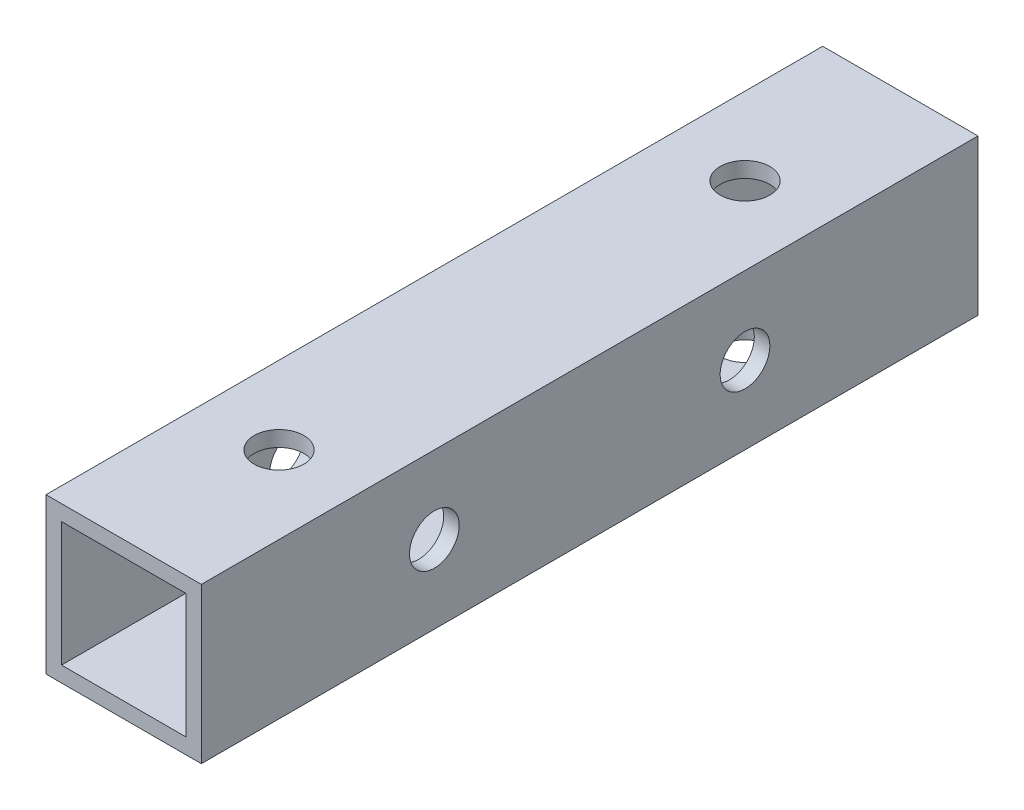
ISO-10303-21;
HEADER;
FILE_DESCRIPTION(('STEP AP214'),'2;1');
FILE_NAME('part.step','',(''),(''),'','','');
FILE_SCHEMA(('AUTOMOTIVE_DESIGN { 1 0 10303 214 1 1 1 1 }'));
ENDSEC;
DATA;
#1=APPLICATION_CONTEXT('core data for automotive mechanical design processes');
#2=APPLICATION_PROTOCOL_DEFINITION('international standard','automotive_design',2000,#1);
#3=PRODUCT_CONTEXT('',#1,'mechanical');
#4=PRODUCT('Part','Part','',(#3));
#5=PRODUCT_RELATED_PRODUCT_CATEGORY('part','',(#4));
#6=PRODUCT_DEFINITION_FORMATION('','',#4);
#7=PRODUCT_DEFINITION_CONTEXT('part definition',#1,'design');
#8=PRODUCT_DEFINITION('design','',#6,#7);
#9=PRODUCT_DEFINITION_SHAPE('','',#8);
#10=(LENGTH_UNIT() NAMED_UNIT(*) SI_UNIT(.MILLI.,.METRE.));
#11=(NAMED_UNIT(*) PLANE_ANGLE_UNIT() SI_UNIT($,.RADIAN.));
#12=(NAMED_UNIT(*) SI_UNIT($,.STERADIAN.) SOLID_ANGLE_UNIT());
#13=UNCERTAINTY_MEASURE_WITH_UNIT(LENGTH_MEASURE(1.E-05),#10,'distance_accuracy_value','');
#14=(GEOMETRIC_REPRESENTATION_CONTEXT(3) GLOBAL_UNCERTAINTY_ASSIGNED_CONTEXT((#13)) GLOBAL_UNIT_ASSIGNED_CONTEXT((#10,
#11,#12)) REPRESENTATION_CONTEXT('',''));
#15=CARTESIAN_POINT('',(0.,0.,0.));
#16=DIRECTION('',(0.,0.,1.));
#17=DIRECTION('',(1.,0.,0.));
#18=AXIS2_PLACEMENT_3D('',#15,#16,#17);
#19=CARTESIAN_POINT('',(0.,0.,50.));
#20=DIRECTION('',(0.,0.,1.));
#21=DIRECTION('',(1.,0.,0.));
#22=AXIS2_PLACEMENT_3D('',#19,#20,#21);
#23=PLANE('',#22);
#24=DIRECTION('',(0.,1.,0.));
#25=VECTOR('',#24,1.);
#26=CARTESIAN_POINT('',(5.,-5.,50.));
#27=LINE('',#26,#25);
#28=CARTESIAN_POINT('',(5.,-5.,50.));
#29=VERTEX_POINT('',#28);
#30=CARTESIAN_POINT('',(5.,5.,50.));
#31=VERTEX_POINT('',#30);
#32=EDGE_CURVE('E162',#29,#31,#27,.T.);
#33=ORIENTED_EDGE('',*,*,#32,.T.);
#34=DIRECTION('',(-1.,0.,0.));
#35=VECTOR('',#34,1.);
#36=CARTESIAN_POINT('',(-5.,5.,50.));
#37=LINE('',#36,#35);
#38=CARTESIAN_POINT('',(-5.,5.,50.));
#39=VERTEX_POINT('',#38);
#40=EDGE_CURVE('E165',#31,#39,#37,.T.);
#41=ORIENTED_EDGE('',*,*,#40,.T.);
#42=DIRECTION('',(0.,-1.,0.));
#43=VECTOR('',#42,1.);
#44=CARTESIAN_POINT('',(-5.,-5.,50.));
#45=LINE('',#44,#43);
#46=CARTESIAN_POINT('',(-5.,-5.,50.));
#47=VERTEX_POINT('',#46);
#48=EDGE_CURVE('E168',#39,#47,#45,.T.);
#49=ORIENTED_EDGE('',*,*,#48,.T.);
#50=DIRECTION('',(1.,0.,0.));
#51=VECTOR('',#50,1.);
#52=CARTESIAN_POINT('',(-5.,-5.,50.));
#53=LINE('',#52,#51);
#54=EDGE_CURVE('E170',#47,#29,#53,.T.);
#55=ORIENTED_EDGE('',*,*,#54,.T.);
#56=EDGE_LOOP('',(#33,#41,#49,#55));
#57=FACE_BOUND('',#56,.T.);
#58=DIRECTION('',(-1.,0.,0.));
#59=VECTOR('',#58,1.);
#60=CARTESIAN_POINT('',(0.,4.,50.));
#61=LINE('',#60,#59);
#62=CARTESIAN_POINT('',(4.,4.,50.));
#63=VERTEX_POINT('',#62);
#64=CARTESIAN_POINT('',(-4.,4.,50.));
#65=VERTEX_POINT('',#64);
#66=EDGE_CURVE('E132',#63,#65,#61,.T.);
#67=ORIENTED_EDGE('',*,*,#66,.F.);
#68=DIRECTION('',(0.,1.,0.));
#69=VECTOR('',#68,1.);
#70=CARTESIAN_POINT('',(4.,0.,50.));
#71=LINE('',#70,#69);
#72=CARTESIAN_POINT('',(4.,-4.,50.));
#73=VERTEX_POINT('',#72);
#74=EDGE_CURVE('E124',#73,#63,#71,.T.);
#75=ORIENTED_EDGE('',*,*,#74,.F.);
#76=DIRECTION('',(1.,0.,0.));
#77=VECTOR('',#76,1.);
#78=CARTESIAN_POINT('',(0.,-4.,50.));
#79=LINE('',#78,#77);
#80=CARTESIAN_POINT('',(-4.,-4.,50.));
#81=VERTEX_POINT('',#80);
#82=EDGE_CURVE('E146',#81,#73,#79,.T.);
#83=ORIENTED_EDGE('',*,*,#82,.F.);
#84=DIRECTION('',(0.,-1.,0.));
#85=VECTOR('',#84,1.);
#86=CARTESIAN_POINT('',(-4.,0.,50.));
#87=LINE('',#86,#85);
#88=EDGE_CURVE('E144',#65,#81,#87,.T.);
#89=ORIENTED_EDGE('',*,*,#88,.F.);
#90=EDGE_LOOP('',(#67,#75,#83,#89));
#91=FACE_BOUND('',#90,.T.);
#92=ADVANCED_FACE('F57',(#57,#91),#23,.T.);
#93=CARTESIAN_POINT('',(0.,0.,0.));
#94=DIRECTION('',(0.,0.,1.));
#95=DIRECTION('',(1.,0.,0.));
#96=AXIS2_PLACEMENT_3D('',#93,#94,#95);
#97=PLANE('',#96);
#98=DIRECTION('',(0.,1.,0.));
#99=VECTOR('',#98,1.);
#100=CARTESIAN_POINT('',(5.,-5.,0.));
#101=LINE('',#100,#99);
#102=CARTESIAN_POINT('',(5.,-5.,0.));
#103=VERTEX_POINT('',#102);
#104=CARTESIAN_POINT('',(5.,5.,0.));
#105=VERTEX_POINT('',#104);
#106=EDGE_CURVE('E140',#103,#105,#101,.T.);
#107=ORIENTED_EDGE('',*,*,#106,.F.);
#108=DIRECTION('',(1.,0.,0.));
#109=VECTOR('',#108,1.);
#110=CARTESIAN_POINT('',(-5.,-5.,0.));
#111=LINE('',#110,#109);
#112=CARTESIAN_POINT('',(-5.,-5.,0.));
#113=VERTEX_POINT('',#112);
#114=EDGE_CURVE('E166',#113,#103,#111,.T.);
#115=ORIENTED_EDGE('',*,*,#114,.F.);
#116=DIRECTION('',(0.,-1.,0.));
#117=VECTOR('',#116,1.);
#118=CARTESIAN_POINT('',(-5.,-5.,0.));
#119=LINE('',#118,#117);
#120=CARTESIAN_POINT('',(-5.,5.,0.));
#121=VERTEX_POINT('',#120);
#122=EDGE_CURVE('E177',#121,#113,#119,.T.);
#123=ORIENTED_EDGE('',*,*,#122,.F.);
#124=DIRECTION('',(-1.,0.,0.));
#125=VECTOR('',#124,1.);
#126=CARTESIAN_POINT('',(-5.,5.,0.));
#127=LINE('',#126,#125);
#128=EDGE_CURVE('E175',#105,#121,#127,.T.);
#129=ORIENTED_EDGE('',*,*,#128,.F.);
#130=EDGE_LOOP('',(#107,#115,#123,#129));
#131=FACE_BOUND('',#130,.T.);
#132=DIRECTION('',(0.,1.,0.));
#133=VECTOR('',#132,1.);
#134=CARTESIAN_POINT('',(4.,0.,0.));
#135=LINE('',#134,#133);
#136=CARTESIAN_POINT('',(4.,-4.,0.));
#137=VERTEX_POINT('',#136);
#138=CARTESIAN_POINT('',(4.,4.,0.));
#139=VERTEX_POINT('',#138);
#140=EDGE_CURVE('E82',#137,#139,#135,.T.);
#141=ORIENTED_EDGE('',*,*,#140,.T.);
#142=DIRECTION('',(-1.,0.,0.));
#143=VECTOR('',#142,1.);
#144=CARTESIAN_POINT('',(0.,4.,0.));
#145=LINE('',#144,#143);
#146=CARTESIAN_POINT('',(-4.,4.,0.));
#147=VERTEX_POINT('',#146);
#148=EDGE_CURVE('E139',#139,#147,#145,.T.);
#149=ORIENTED_EDGE('',*,*,#148,.T.);
#150=DIRECTION('',(0.,-1.,0.));
#151=VECTOR('',#150,1.);
#152=CARTESIAN_POINT('',(-4.,0.,0.));
#153=LINE('',#152,#151);
#154=CARTESIAN_POINT('',(-4.,-4.,0.));
#155=VERTEX_POINT('',#154);
#156=EDGE_CURVE('E154',#147,#155,#153,.T.);
#157=ORIENTED_EDGE('',*,*,#156,.T.);
#158=DIRECTION('',(1.,0.,0.));
#159=VECTOR('',#158,1.);
#160=CARTESIAN_POINT('',(0.,-4.,0.));
#161=LINE('',#160,#159);
#162=EDGE_CURVE('E133',#155,#137,#161,.T.);
#163=ORIENTED_EDGE('',*,*,#162,.T.);
#164=EDGE_LOOP('',(#141,#149,#157,#163));
#165=FACE_BOUND('',#164,.T.);
#166=ADVANCED_FACE('F265',(#131,#165),#97,.F.);
#167=CARTESIAN_POINT('',(5.,-5.,50.));
#168=DIRECTION('',(-1.,0.,0.));
#169=DIRECTION('',(0.,0.,1.));
#170=AXIS2_PLACEMENT_3D('',#167,#168,#169);
#171=PLANE('',#170);
#172=CARTESIAN_POINT('',(5.,0.,15.));
#173=DIRECTION('',(1.,0.,0.));
#174=DIRECTION('',(0.,0.,-1.));
#175=AXIS2_PLACEMENT_3D('',#172,#173,#174);
#176=CIRCLE('',#175,1.6);
#177=CARTESIAN_POINT('',(5.,0.,13.4));
#178=VERTEX_POINT('',#177);
#179=EDGE_CURVE('E203',#178,#178,#176,.T.);
#180=ORIENTED_EDGE('',*,*,#179,.F.);
#181=EDGE_LOOP('',(#180));
#182=FACE_BOUND('',#181,.T.);
#183=CARTESIAN_POINT('',(5.,0.,35.));
#184=DIRECTION('',(1.,0.,0.));
#185=DIRECTION('',(0.,0.,-1.));
#186=AXIS2_PLACEMENT_3D('',#183,#184,#185);
#187=CIRCLE('',#186,1.6);
#188=CARTESIAN_POINT('',(5.,0.,33.4));
#189=VERTEX_POINT('',#188);
#190=EDGE_CURVE('E213',#189,#189,#187,.T.);
#191=ORIENTED_EDGE('',*,*,#190,.F.);
#192=EDGE_LOOP('',(#191));
#193=FACE_BOUND('',#192,.T.);
#194=ORIENTED_EDGE('',*,*,#106,.T.);
#195=DIRECTION('',(0.,0.,-1.));
#196=VECTOR('',#195,1.);
#197=CARTESIAN_POINT('',(5.,5.,50.));
#198=LINE('',#197,#196);
#199=EDGE_CURVE('E12',#31,#105,#198,.T.);
#200=ORIENTED_EDGE('',*,*,#199,.F.);
#201=ORIENTED_EDGE('',*,*,#32,.F.);
#202=DIRECTION('',(0.,0.,-1.));
#203=VECTOR('',#202,1.);
#204=CARTESIAN_POINT('',(5.,-5.,50.));
#205=LINE('',#204,#203);
#206=EDGE_CURVE('E172',#29,#103,#205,.T.);
#207=ORIENTED_EDGE('',*,*,#206,.T.);
#208=EDGE_LOOP('',(#194,#200,#201,#207));
#209=FACE_BOUND('',#208,.T.);
#210=ADVANCED_FACE('F59',(#182,#193,#209),#171,.F.);
#211=CARTESIAN_POINT('',(-5.,5.,50.));
#212=DIRECTION('',(0.,-1.,0.));
#213=DIRECTION('',(0.,0.,-1.));
#214=AXIS2_PLACEMENT_3D('',#211,#212,#213);
#215=PLANE('',#214);
#216=CARTESIAN_POINT('',(0.,5.,10.));
#217=DIRECTION('',(0.,1.,0.));
#218=DIRECTION('',(0.,0.,1.));
#219=AXIS2_PLACEMENT_3D('',#216,#217,#218);
#220=CIRCLE('',#219,1.6);
#221=CARTESIAN_POINT('',(0.,5.,11.6));
#222=VERTEX_POINT('',#221);
#223=EDGE_CURVE('E222',#222,#222,#220,.T.);
#224=ORIENTED_EDGE('',*,*,#223,.F.);
#225=EDGE_LOOP('',(#224));
#226=FACE_BOUND('',#225,.T.);
#227=CARTESIAN_POINT('',(0.,5.,40.));
#228=DIRECTION('',(0.,1.,0.));
#229=DIRECTION('',(0.,0.,1.));
#230=AXIS2_PLACEMENT_3D('',#227,#228,#229);
#231=CIRCLE('',#230,1.6);
#232=CARTESIAN_POINT('',(0.,5.,41.6));
#233=VERTEX_POINT('',#232);
#234=EDGE_CURVE('E219',#233,#233,#231,.T.);
#235=ORIENTED_EDGE('',*,*,#234,.F.);
#236=EDGE_LOOP('',(#235));
#237=FACE_BOUND('',#236,.T.);
#238=ORIENTED_EDGE('',*,*,#128,.T.);
#239=DIRECTION('',(0.,0.,-1.));
#240=VECTOR('',#239,1.);
#241=CARTESIAN_POINT('',(-5.,5.,50.));
#242=LINE('',#241,#240);
#243=EDGE_CURVE('E66',#39,#121,#242,.T.);
#244=ORIENTED_EDGE('',*,*,#243,.F.);
#245=ORIENTED_EDGE('',*,*,#40,.F.);
#246=ORIENTED_EDGE('',*,*,#199,.T.);
#247=EDGE_LOOP('',(#238,#244,#245,#246));
#248=FACE_BOUND('',#247,.T.);
#249=ADVANCED_FACE('F251',(#226,#237,#248),#215,.F.);
#250=CARTESIAN_POINT('',(-5.,-5.,50.));
#251=DIRECTION('',(1.,0.,0.));
#252=DIRECTION('',(0.,0.,-1.));
#253=AXIS2_PLACEMENT_3D('',#250,#251,#252);
#254=PLANE('',#253);
#255=CARTESIAN_POINT('',(-5.,0.,15.));
#256=DIRECTION('',(1.,0.,0.));
#257=DIRECTION('',(0.,0.,-1.));
#258=AXIS2_PLACEMENT_3D('',#255,#256,#257);
#259=CIRCLE('',#258,1.6);
#260=CARTESIAN_POINT('',(-5.,0.,13.4));
#261=VERTEX_POINT('',#260);
#262=EDGE_CURVE('E197',#261,#261,#259,.T.);
#263=ORIENTED_EDGE('',*,*,#262,.T.);
#264=EDGE_LOOP('',(#263));
#265=FACE_BOUND('',#264,.T.);
#266=CARTESIAN_POINT('',(-5.,0.,35.));
#267=DIRECTION('',(1.,0.,0.));
#268=DIRECTION('',(0.,0.,-1.));
#269=AXIS2_PLACEMENT_3D('',#266,#267,#268);
#270=CIRCLE('',#269,1.6);
#271=CARTESIAN_POINT('',(-5.,0.,33.4));
#272=VERTEX_POINT('',#271);
#273=EDGE_CURVE('E208',#272,#272,#270,.T.);
#274=ORIENTED_EDGE('',*,*,#273,.T.);
#275=EDGE_LOOP('',(#274));
#276=FACE_BOUND('',#275,.T.);
#277=ORIENTED_EDGE('',*,*,#122,.T.);
#278=DIRECTION('',(0.,0.,-1.));
#279=VECTOR('',#278,1.);
#280=CARTESIAN_POINT('',(-5.,-5.,50.));
#281=LINE('',#280,#279);
#282=EDGE_CURVE('E182',#47,#113,#281,.T.);
#283=ORIENTED_EDGE('',*,*,#282,.F.);
#284=ORIENTED_EDGE('',*,*,#48,.F.);
#285=ORIENTED_EDGE('',*,*,#243,.T.);
#286=EDGE_LOOP('',(#277,#283,#284,#285));
#287=FACE_BOUND('',#286,.T.);
#288=ADVANCED_FACE('F254',(#265,#276,#287),#254,.F.);
#289=CARTESIAN_POINT('',(-5.,-5.,50.));
#290=DIRECTION('',(0.,1.,0.));
#291=DIRECTION('',(0.,0.,1.));
#292=AXIS2_PLACEMENT_3D('',#289,#290,#291);
#293=PLANE('',#292);
#294=CARTESIAN_POINT('',(0.,-5.,10.));
#295=DIRECTION('',(0.,1.,0.));
#296=DIRECTION('',(0.,0.,1.));
#297=AXIS2_PLACEMENT_3D('',#294,#295,#296);
#298=CIRCLE('',#297,1.6);
#299=CARTESIAN_POINT('',(0.,-5.,11.6));
#300=VERTEX_POINT('',#299);
#301=EDGE_CURVE('E191',#300,#300,#298,.T.);
#302=ORIENTED_EDGE('',*,*,#301,.T.);
#303=EDGE_LOOP('',(#302));
#304=FACE_BOUND('',#303,.T.);
#305=CARTESIAN_POINT('',(0.,-5.,40.));
#306=DIRECTION('',(0.,1.,0.));
#307=DIRECTION('',(0.,0.,1.));
#308=AXIS2_PLACEMENT_3D('',#305,#306,#307);
#309=CIRCLE('',#308,1.6);
#310=CARTESIAN_POINT('',(0.,-5.,41.6));
#311=VERTEX_POINT('',#310);
#312=EDGE_CURVE('E225',#311,#311,#309,.T.);
#313=ORIENTED_EDGE('',*,*,#312,.T.);
#314=EDGE_LOOP('',(#313));
#315=FACE_BOUND('',#314,.T.);
#316=ORIENTED_EDGE('',*,*,#114,.T.);
#317=ORIENTED_EDGE('',*,*,#206,.F.);
#318=ORIENTED_EDGE('',*,*,#54,.F.);
#319=ORIENTED_EDGE('',*,*,#282,.T.);
#320=EDGE_LOOP('',(#316,#317,#318,#319));
#321=FACE_BOUND('',#320,.T.);
#322=ADVANCED_FACE('F269',(#304,#315,#321),#293,.F.);
#323=CARTESIAN_POINT('',(4.,0.,50.));
#324=DIRECTION('',(-1.,0.,0.));
#325=DIRECTION('',(0.,0.,1.));
#326=AXIS2_PLACEMENT_3D('',#323,#324,#325);
#327=PLANE('',#326);
#328=CARTESIAN_POINT('',(4.,0.,15.));
#329=DIRECTION('',(-1.,0.,0.));
#330=DIRECTION('',(0.,0.,1.));
#331=AXIS2_PLACEMENT_3D('',#328,#329,#330);
#332=CIRCLE('',#331,1.6);
#333=CARTESIAN_POINT('',(4.,0.,16.6));
#334=VERTEX_POINT('',#333);
#335=EDGE_CURVE('E216',#334,#334,#332,.T.);
#336=ORIENTED_EDGE('',*,*,#335,.F.);
#337=EDGE_LOOP('',(#336));
#338=FACE_BOUND('',#337,.T.);
#339=CARTESIAN_POINT('',(4.,0.,35.));
#340=DIRECTION('',(-1.,0.,0.));
#341=DIRECTION('',(0.,0.,1.));
#342=AXIS2_PLACEMENT_3D('',#339,#340,#341);
#343=CIRCLE('',#342,1.6);
#344=CARTESIAN_POINT('',(4.,0.,36.6));
#345=VERTEX_POINT('',#344);
#346=EDGE_CURVE('E196',#345,#345,#343,.T.);
#347=ORIENTED_EDGE('',*,*,#346,.F.);
#348=EDGE_LOOP('',(#347));
#349=FACE_BOUND('',#348,.T.);
#350=ORIENTED_EDGE('',*,*,#140,.F.);
#351=DIRECTION('',(0.,0.,-1.));
#352=VECTOR('',#351,1.);
#353=CARTESIAN_POINT('',(4.,-4.,50.));
#354=LINE('',#353,#352);
#355=EDGE_CURVE('E128',#73,#137,#354,.T.);
#356=ORIENTED_EDGE('',*,*,#355,.F.);
#357=ORIENTED_EDGE('',*,*,#74,.T.);
#358=DIRECTION('',(0.,0.,-1.));
#359=VECTOR('',#358,1.);
#360=CARTESIAN_POINT('',(4.,4.,50.));
#361=LINE('',#360,#359);
#362=EDGE_CURVE('E127',#63,#139,#361,.T.);
#363=ORIENTED_EDGE('',*,*,#362,.T.);
#364=EDGE_LOOP('',(#350,#356,#357,#363));
#365=FACE_BOUND('',#364,.T.);
#366=ADVANCED_FACE('F126',(#338,#349,#365),#327,.T.);
#367=CARTESIAN_POINT('',(0.,4.,50.));
#368=DIRECTION('',(0.,-1.,0.));
#369=DIRECTION('',(0.,0.,-1.));
#370=AXIS2_PLACEMENT_3D('',#367,#368,#369);
#371=PLANE('',#370);
#372=CARTESIAN_POINT('',(0.,4.,10.));
#373=DIRECTION('',(0.,-1.,0.));
#374=DIRECTION('',(0.,0.,-1.));
#375=AXIS2_PLACEMENT_3D('',#372,#373,#374);
#376=CIRCLE('',#375,1.6);
#377=CARTESIAN_POINT('',(0.,4.,8.4));
#378=VERTEX_POINT('',#377);
#379=EDGE_CURVE('E152',#378,#378,#376,.T.);
#380=ORIENTED_EDGE('',*,*,#379,.F.);
#381=EDGE_LOOP('',(#380));
#382=FACE_BOUND('',#381,.T.);
#383=CARTESIAN_POINT('',(0.,4.,40.));
#384=DIRECTION('',(0.,-1.,0.));
#385=DIRECTION('',(0.,0.,-1.));
#386=AXIS2_PLACEMENT_3D('',#383,#384,#385);
#387=CIRCLE('',#386,1.6);
#388=CARTESIAN_POINT('',(0.,4.,38.4));
#389=VERTEX_POINT('',#388);
#390=EDGE_CURVE('E190',#389,#389,#387,.T.);
#391=ORIENTED_EDGE('',*,*,#390,.F.);
#392=EDGE_LOOP('',(#391));
#393=FACE_BOUND('',#392,.T.);
#394=ORIENTED_EDGE('',*,*,#148,.F.);
#395=ORIENTED_EDGE('',*,*,#362,.F.);
#396=ORIENTED_EDGE('',*,*,#66,.T.);
#397=DIRECTION('',(0.,0.,-1.));
#398=VECTOR('',#397,1.);
#399=CARTESIAN_POINT('',(-4.,4.,50.));
#400=LINE('',#399,#398);
#401=EDGE_CURVE('E141',#65,#147,#400,.T.);
#402=ORIENTED_EDGE('',*,*,#401,.T.);
#403=EDGE_LOOP('',(#394,#395,#396,#402));
#404=FACE_BOUND('',#403,.T.);
#405=ADVANCED_FACE('F136',(#382,#393,#404),#371,.T.);
#406=CARTESIAN_POINT('',(-4.,0.,50.));
#407=DIRECTION('',(1.,0.,0.));
#408=DIRECTION('',(0.,0.,-1.));
#409=AXIS2_PLACEMENT_3D('',#406,#407,#408);
#410=PLANE('',#409);
#411=CARTESIAN_POINT('',(-4.,0.,15.));
#412=DIRECTION('',(1.,0.,0.));
#413=DIRECTION('',(0.,0.,-1.));
#414=AXIS2_PLACEMENT_3D('',#411,#412,#413);
#415=CIRCLE('',#414,1.6);
#416=CARTESIAN_POINT('',(-4.,0.,13.4));
#417=VERTEX_POINT('',#416);
#418=EDGE_CURVE('E61',#417,#417,#415,.T.);
#419=ORIENTED_EDGE('',*,*,#418,.F.);
#420=EDGE_LOOP('',(#419));
#421=FACE_BOUND('',#420,.T.);
#422=CARTESIAN_POINT('',(-4.,0.,35.));
#423=DIRECTION('',(1.,0.,0.));
#424=DIRECTION('',(0.,0.,-1.));
#425=AXIS2_PLACEMENT_3D('',#422,#423,#424);
#426=CIRCLE('',#425,1.6);
#427=CARTESIAN_POINT('',(-4.,0.,33.4));
#428=VERTEX_POINT('',#427);
#429=EDGE_CURVE('E194',#428,#428,#426,.T.);
#430=ORIENTED_EDGE('',*,*,#429,.F.);
#431=EDGE_LOOP('',(#430));
#432=FACE_BOUND('',#431,.T.);
#433=ORIENTED_EDGE('',*,*,#156,.F.);
#434=ORIENTED_EDGE('',*,*,#401,.F.);
#435=ORIENTED_EDGE('',*,*,#88,.T.);
#436=DIRECTION('',(0.,0.,-1.));
#437=VECTOR('',#436,1.);
#438=CARTESIAN_POINT('',(-4.,-4.,50.));
#439=LINE('',#438,#437);
#440=EDGE_CURVE('E74',#81,#155,#439,.T.);
#441=ORIENTED_EDGE('',*,*,#440,.T.);
#442=EDGE_LOOP('',(#433,#434,#435,#441));
#443=FACE_BOUND('',#442,.T.);
#444=ADVANCED_FACE('F239',(#421,#432,#443),#410,.T.);
#445=CARTESIAN_POINT('',(0.,-4.,50.));
#446=DIRECTION('',(0.,1.,0.));
#447=DIRECTION('',(0.,0.,1.));
#448=AXIS2_PLACEMENT_3D('',#445,#446,#447);
#449=PLANE('',#448);
#450=CARTESIAN_POINT('',(0.,-4.,10.));
#451=DIRECTION('',(0.,1.,0.));
#452=DIRECTION('',(0.,0.,1.));
#453=AXIS2_PLACEMENT_3D('',#450,#451,#452);
#454=CIRCLE('',#453,1.6);
#455=CARTESIAN_POINT('',(0.,-4.,11.6));
#456=VERTEX_POINT('',#455);
#457=EDGE_CURVE('E192',#456,#456,#454,.T.);
#458=ORIENTED_EDGE('',*,*,#457,.F.);
#459=EDGE_LOOP('',(#458));
#460=FACE_BOUND('',#459,.T.);
#461=CARTESIAN_POINT('',(0.,-4.,40.));
#462=DIRECTION('',(0.,1.,0.));
#463=DIRECTION('',(0.,0.,1.));
#464=AXIS2_PLACEMENT_3D('',#461,#462,#463);
#465=CIRCLE('',#464,1.6);
#466=CARTESIAN_POINT('',(0.,-4.,41.6));
#467=VERTEX_POINT('',#466);
#468=EDGE_CURVE('E187',#467,#467,#465,.T.);
#469=ORIENTED_EDGE('',*,*,#468,.F.);
#470=EDGE_LOOP('',(#469));
#471=FACE_BOUND('',#470,.T.);
#472=ORIENTED_EDGE('',*,*,#162,.F.);
#473=ORIENTED_EDGE('',*,*,#440,.F.);
#474=ORIENTED_EDGE('',*,*,#82,.T.);
#475=ORIENTED_EDGE('',*,*,#355,.T.);
#476=EDGE_LOOP('',(#472,#473,#474,#475));
#477=FACE_BOUND('',#476,.T.);
#478=ADVANCED_FACE('F351',(#460,#471,#477),#449,.T.);
#479=CARTESIAN_POINT('',(0.,-5.,40.));
#480=DIRECTION('',(0.,1.,0.));
#481=DIRECTION('',(0.,0.,1.));
#482=AXIS2_PLACEMENT_3D('',#479,#480,#481);
#483=CYLINDRICAL_SURFACE('',#482,1.6);
#484=ORIENTED_EDGE('',*,*,#468,.T.);
#485=EDGE_LOOP('',(#484));
#486=FACE_BOUND('',#485,.T.);
#487=ORIENTED_EDGE('',*,*,#312,.F.);
#488=EDGE_LOOP('',(#487));
#489=FACE_BOUND('',#488,.T.);
#490=ADVANCED_FACE('F248',(#486,#489),#483,.F.);
#491=CARTESIAN_POINT('',(0.,-5.,10.));
#492=DIRECTION('',(0.,1.,0.));
#493=DIRECTION('',(0.,0.,1.));
#494=AXIS2_PLACEMENT_3D('',#491,#492,#493);
#495=CYLINDRICAL_SURFACE('',#494,1.6);
#496=ORIENTED_EDGE('',*,*,#457,.T.);
#497=EDGE_LOOP('',(#496));
#498=FACE_BOUND('',#497,.T.);
#499=ORIENTED_EDGE('',*,*,#301,.F.);
#500=EDGE_LOOP('',(#499));
#501=FACE_BOUND('',#500,.T.);
#502=ADVANCED_FACE('F246',(#498,#501),#495,.F.);
#503=ORIENTED_EDGE('',*,*,#390,.T.);
#504=EDGE_LOOP('',(#503));
#505=FACE_BOUND('',#504,.T.);
#506=ORIENTED_EDGE('',*,*,#234,.T.);
#507=EDGE_LOOP('',(#506));
#508=FACE_BOUND('',#507,.T.);
#509=ADVANCED_FACE('F243',(#505,#508),#483,.F.);
#510=ORIENTED_EDGE('',*,*,#379,.T.);
#511=EDGE_LOOP('',(#510));
#512=FACE_BOUND('',#511,.T.);
#513=ORIENTED_EDGE('',*,*,#223,.T.);
#514=EDGE_LOOP('',(#513));
#515=FACE_BOUND('',#514,.T.);
#516=ADVANCED_FACE('F234',(#512,#515),#495,.F.);
#517=CARTESIAN_POINT('',(-5.,0.,35.));
#518=DIRECTION('',(1.,0.,0.));
#519=DIRECTION('',(0.,0.,-1.));
#520=AXIS2_PLACEMENT_3D('',#517,#518,#519);
#521=CYLINDRICAL_SURFACE('',#520,1.6);
#522=ORIENTED_EDGE('',*,*,#429,.T.);
#523=EDGE_LOOP('',(#522));
#524=FACE_BOUND('',#523,.T.);
#525=ORIENTED_EDGE('',*,*,#273,.F.);
#526=EDGE_LOOP('',(#525));
#527=FACE_BOUND('',#526,.T.);
#528=ADVANCED_FACE('F291',(#524,#527),#521,.F.);
#529=CARTESIAN_POINT('',(-5.,0.,15.));
#530=DIRECTION('',(1.,0.,0.));
#531=DIRECTION('',(0.,0.,-1.));
#532=AXIS2_PLACEMENT_3D('',#529,#530,#531);
#533=CYLINDRICAL_SURFACE('',#532,1.6);
#534=ORIENTED_EDGE('',*,*,#418,.T.);
#535=EDGE_LOOP('',(#534));
#536=FACE_BOUND('',#535,.T.);
#537=ORIENTED_EDGE('',*,*,#262,.F.);
#538=EDGE_LOOP('',(#537));
#539=FACE_BOUND('',#538,.T.);
#540=ADVANCED_FACE('F293',(#536,#539),#533,.F.);
#541=ORIENTED_EDGE('',*,*,#346,.T.);
#542=EDGE_LOOP('',(#541));
#543=FACE_BOUND('',#542,.T.);
#544=ORIENTED_EDGE('',*,*,#190,.T.);
#545=EDGE_LOOP('',(#544));
#546=FACE_BOUND('',#545,.T.);
#547=ADVANCED_FACE('F295',(#543,#546),#521,.F.);
#548=ORIENTED_EDGE('',*,*,#335,.T.);
#549=EDGE_LOOP('',(#548));
#550=FACE_BOUND('',#549,.T.);
#551=ORIENTED_EDGE('',*,*,#179,.T.);
#552=EDGE_LOOP('',(#551));
#553=FACE_BOUND('',#552,.T.);
#554=ADVANCED_FACE('F302',(#550,#553),#533,.F.);
#555=CLOSED_SHELL('',(#92,#166,#210,#249,#288,#322,#366,#405,#444,#478,#490,#502,#509,#516,#528,
#540,#547,#554));
#556=MANIFOLD_SOLID_BREP('B2',#555);
#557=ADVANCED_BREP_SHAPE_REPRESENTATION('',(#18,#556),#14);
#558=SHAPE_DEFINITION_REPRESENTATION(#9,#557);
ENDSEC;
END-ISO-10303-21;
